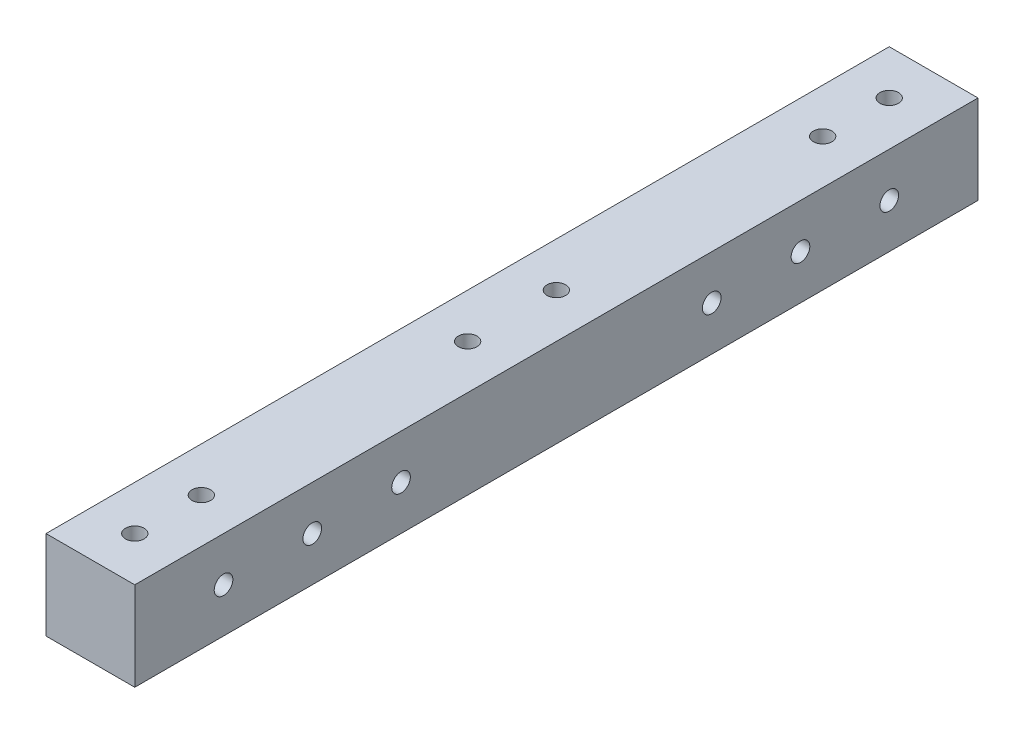
ISO-10303-21;
HEADER;
FILE_DESCRIPTION(('STEP AP214'),'2;1');
FILE_NAME('part.step','',(''),(''),'','','');
FILE_SCHEMA(('AUTOMOTIVE_DESIGN { 1 0 10303 214 1 1 1 1 }'));
ENDSEC;
DATA;
#1=APPLICATION_CONTEXT('core data for automotive mechanical design processes');
#2=APPLICATION_PROTOCOL_DEFINITION('international standard','automotive_design',2000,#1);
#3=PRODUCT_CONTEXT('',#1,'mechanical');
#4=PRODUCT('Part','Part','',(#3));
#5=PRODUCT_RELATED_PRODUCT_CATEGORY('part','',(#4));
#6=PRODUCT_DEFINITION_FORMATION('','',#4);
#7=PRODUCT_DEFINITION_CONTEXT('part definition',#1,'design');
#8=PRODUCT_DEFINITION('design','',#6,#7);
#9=PRODUCT_DEFINITION_SHAPE('','',#8);
#10=(LENGTH_UNIT() NAMED_UNIT(*) SI_UNIT(.MILLI.,.METRE.));
#11=(NAMED_UNIT(*) PLANE_ANGLE_UNIT() SI_UNIT($,.RADIAN.));
#12=(NAMED_UNIT(*) SI_UNIT($,.STERADIAN.) SOLID_ANGLE_UNIT());
#13=UNCERTAINTY_MEASURE_WITH_UNIT(LENGTH_MEASURE(1.E-05),#10,'distance_accuracy_value','');
#14=(GEOMETRIC_REPRESENTATION_CONTEXT(3) GLOBAL_UNCERTAINTY_ASSIGNED_CONTEXT((#13)) GLOBAL_UNIT_ASSIGNED_CONTEXT((#10,
#11,#12)) REPRESENTATION_CONTEXT('',''));
#15=CARTESIAN_POINT('',(0.,0.,0.));
#16=DIRECTION('',(0.,0.,1.));
#17=DIRECTION('',(1.,0.,0.));
#18=AXIS2_PLACEMENT_3D('',#15,#16,#17);
#19=CARTESIAN_POINT('',(10.,10.,190.));
#20=DIRECTION('',(-1.,0.,0.));
#21=DIRECTION('',(0.,-1.,0.));
#22=AXIS2_PLACEMENT_3D('',#19,#20,#21);
#23=PLANE('',#22);
#24=CARTESIAN_POINT('',(10.,0.,20.));
#25=DIRECTION('',(-1.,0.,0.));
#26=DIRECTION('',(0.,-1.,0.));
#27=AXIS2_PLACEMENT_3D('',#24,#25,#26);
#28=CIRCLE('',#27,2.1);
#29=CARTESIAN_POINT('',(10.,-2.1,20.));
#30=VERTEX_POINT('',#29);
#31=EDGE_CURVE('E102',#30,#30,#28,.T.);
#32=ORIENTED_EDGE('',*,*,#31,.T.);
#33=EDGE_LOOP('',(#32));
#34=FACE_BOUND('',#33,.T.);
#35=CARTESIAN_POINT('',(10.,0.,60.));
#36=DIRECTION('',(-1.,0.,0.));
#37=DIRECTION('',(0.,-1.,0.));
#38=AXIS2_PLACEMENT_3D('',#35,#36,#37);
#39=CIRCLE('',#38,2.1);
#40=CARTESIAN_POINT('',(10.,-2.1,60.));
#41=VERTEX_POINT('',#40);
#42=EDGE_CURVE('E157',#41,#41,#39,.T.);
#43=ORIENTED_EDGE('',*,*,#42,.T.);
#44=EDGE_LOOP('',(#43));
#45=FACE_BOUND('',#44,.T.);
#46=CARTESIAN_POINT('',(10.,0.,130.));
#47=DIRECTION('',(-1.,0.,0.));
#48=DIRECTION('',(0.,-1.,0.));
#49=AXIS2_PLACEMENT_3D('',#46,#47,#48);
#50=CIRCLE('',#49,2.09999999999999);
#51=CARTESIAN_POINT('',(10.,-2.09999999999999,130.));
#52=VERTEX_POINT('',#51);
#53=EDGE_CURVE('E154',#52,#52,#50,.T.);
#54=ORIENTED_EDGE('',*,*,#53,.T.);
#55=EDGE_LOOP('',(#54));
#56=FACE_BOUND('',#55,.T.);
#57=CARTESIAN_POINT('',(10.,0.,170.));
#58=DIRECTION('',(-1.,0.,0.));
#59=DIRECTION('',(0.,-1.,0.));
#60=AXIS2_PLACEMENT_3D('',#57,#58,#59);
#61=CIRCLE('',#60,2.09999999999999);
#62=CARTESIAN_POINT('',(10.,-2.09999999999999,170.));
#63=VERTEX_POINT('',#62);
#64=EDGE_CURVE('E151',#63,#63,#61,.T.);
#65=ORIENTED_EDGE('',*,*,#64,.T.);
#66=EDGE_LOOP('',(#65));
#67=FACE_BOUND('',#66,.T.);
#68=CARTESIAN_POINT('',(10.,0.,150.));
#69=DIRECTION('',(-1.,0.,0.));
#70=DIRECTION('',(0.,-1.,0.));
#71=AXIS2_PLACEMENT_3D('',#68,#69,#70);
#72=CIRCLE('',#71,2.09999999999999);
#73=CARTESIAN_POINT('',(10.,-2.09999999999999,150.));
#74=VERTEX_POINT('',#73);
#75=EDGE_CURVE('E148',#74,#74,#72,.T.);
#76=ORIENTED_EDGE('',*,*,#75,.T.);
#77=EDGE_LOOP('',(#76));
#78=FACE_BOUND('',#77,.T.);
#79=CARTESIAN_POINT('',(10.,0.,40.));
#80=DIRECTION('',(-1.,0.,0.));
#81=DIRECTION('',(0.,-1.,0.));
#82=AXIS2_PLACEMENT_3D('',#79,#80,#81);
#83=CIRCLE('',#82,2.1);
#84=CARTESIAN_POINT('',(10.,-2.1,40.));
#85=VERTEX_POINT('',#84);
#86=EDGE_CURVE('E145',#85,#85,#83,.T.);
#87=ORIENTED_EDGE('',*,*,#86,.T.);
#88=EDGE_LOOP('',(#87));
#89=FACE_BOUND('',#88,.T.);
#90=DIRECTION('',(0.,1.,0.));
#91=VECTOR('',#90,1.);
#92=CARTESIAN_POINT('',(10.,10.,0.));
#93=LINE('',#92,#91);
#94=CARTESIAN_POINT('',(10.,-10.,0.));
#95=VERTEX_POINT('',#94);
#96=CARTESIAN_POINT('',(10.,10.,0.));
#97=VERTEX_POINT('',#96);
#98=EDGE_CURVE('E99',#95,#97,#93,.T.);
#99=ORIENTED_EDGE('',*,*,#98,.T.);
#100=DIRECTION('',(0.,0.,-1.));
#101=VECTOR('',#100,1.);
#102=CARTESIAN_POINT('',(10.,10.,190.));
#103=LINE('',#102,#101);
#104=CARTESIAN_POINT('',(10.,10.,190.));
#105=VERTEX_POINT('',#104);
#106=EDGE_CURVE('E11',#105,#97,#103,.T.);
#107=ORIENTED_EDGE('',*,*,#106,.F.);
#108=DIRECTION('',(0.,1.,0.));
#109=VECTOR('',#108,1.);
#110=CARTESIAN_POINT('',(10.,10.,190.));
#111=LINE('',#110,#109);
#112=CARTESIAN_POINT('',(10.,-10.,190.));
#113=VERTEX_POINT('',#112);
#114=EDGE_CURVE('E86',#113,#105,#111,.T.);
#115=ORIENTED_EDGE('',*,*,#114,.F.);
#116=DIRECTION('',(0.,0.,-1.));
#117=VECTOR('',#116,1.);
#118=CARTESIAN_POINT('',(10.,-10.,190.));
#119=LINE('',#118,#117);
#120=EDGE_CURVE('E95',#113,#95,#119,.T.);
#121=ORIENTED_EDGE('',*,*,#120,.T.);
#122=EDGE_LOOP('',(#99,#107,#115,#121));
#123=FACE_BOUND('',#122,.T.);
#124=ADVANCED_FACE('F33',(#34,#45,#56,#67,#78,#89,#123),#23,.F.);
#125=CARTESIAN_POINT('',(-10.,10.,190.));
#126=DIRECTION('',(0.,-1.,0.));
#127=DIRECTION('',(0.,0.,-1.));
#128=AXIS2_PLACEMENT_3D('',#125,#126,#127);
#129=PLANE('',#128);
#130=CARTESIAN_POINT('',(0.,10.,85.));
#131=DIRECTION('',(0.,1.,0.));
#132=DIRECTION('',(0.,0.,1.));
#133=AXIS2_PLACEMENT_3D('',#130,#131,#132);
#134=CIRCLE('',#133,2.1);
#135=CARTESIAN_POINT('',(0.,10.,87.1));
#136=VERTEX_POINT('',#135);
#137=EDGE_CURVE('E261',#136,#136,#134,.T.);
#138=ORIENTED_EDGE('',*,*,#137,.F.);
#139=EDGE_LOOP('',(#138));
#140=FACE_BOUND('',#139,.T.);
#141=CARTESIAN_POINT('',(0.,10.,105.));
#142=DIRECTION('',(0.,1.,0.));
#143=DIRECTION('',(0.,0.,-1.));
#144=AXIS2_PLACEMENT_3D('',#141,#142,#143);
#145=CIRCLE('',#144,2.1);
#146=CARTESIAN_POINT('',(0.,10.,102.9));
#147=VERTEX_POINT('',#146);
#148=EDGE_CURVE('E266',#147,#147,#145,.T.);
#149=ORIENTED_EDGE('',*,*,#148,.F.);
#150=EDGE_LOOP('',(#149));
#151=FACE_BOUND('',#150,.T.);
#152=CARTESIAN_POINT('',(0.,10.,180.));
#153=DIRECTION('',(0.,1.,0.));
#154=DIRECTION('',(0.,0.,1.));
#155=AXIS2_PLACEMENT_3D('',#152,#153,#154);
#156=CIRCLE('',#155,2.1);
#157=CARTESIAN_POINT('',(0.,10.,182.1));
#158=VERTEX_POINT('',#157);
#159=EDGE_CURVE('E112',#158,#158,#156,.T.);
#160=ORIENTED_EDGE('',*,*,#159,.F.);
#161=EDGE_LOOP('',(#160));
#162=FACE_BOUND('',#161,.T.);
#163=CARTESIAN_POINT('',(0.,10.,165.));
#164=DIRECTION('',(0.,1.,0.));
#165=DIRECTION('',(0.,0.,1.));
#166=AXIS2_PLACEMENT_3D('',#163,#164,#165);
#167=CIRCLE('',#166,2.1);
#168=CARTESIAN_POINT('',(0.,10.,167.1));
#169=VERTEX_POINT('',#168);
#170=EDGE_CURVE('E273',#169,#169,#167,.T.);
#171=ORIENTED_EDGE('',*,*,#170,.F.);
#172=EDGE_LOOP('',(#171));
#173=FACE_BOUND('',#172,.T.);
#174=CARTESIAN_POINT('',(0.,10.,25.));
#175=DIRECTION('',(0.,1.,0.));
#176=DIRECTION('',(0.,0.,-1.));
#177=AXIS2_PLACEMENT_3D('',#174,#175,#176);
#178=CIRCLE('',#177,2.1);
#179=CARTESIAN_POINT('',(0.,10.,22.9));
#180=VERTEX_POINT('',#179);
#181=EDGE_CURVE('E275',#180,#180,#178,.T.);
#182=ORIENTED_EDGE('',*,*,#181,.F.);
#183=EDGE_LOOP('',(#182));
#184=FACE_BOUND('',#183,.T.);
#185=CARTESIAN_POINT('',(0.,10.,10.));
#186=DIRECTION('',(0.,1.,0.));
#187=DIRECTION('',(0.,0.,-1.));
#188=AXIS2_PLACEMENT_3D('',#185,#186,#187);
#189=CIRCLE('',#188,2.1);
#190=CARTESIAN_POINT('',(0.,10.,7.90000000000001));
#191=VERTEX_POINT('',#190);
#192=EDGE_CURVE('E132',#191,#191,#189,.T.);
#193=ORIENTED_EDGE('',*,*,#192,.F.);
#194=EDGE_LOOP('',(#193));
#195=FACE_BOUND('',#194,.T.);
#196=DIRECTION('',(-1.,0.,0.));
#197=VECTOR('',#196,1.);
#198=CARTESIAN_POINT('',(-10.,10.,0.));
#199=LINE('',#198,#197);
#200=CARTESIAN_POINT('',(-10.,10.,0.));
#201=VERTEX_POINT('',#200);
#202=EDGE_CURVE('E90',#97,#201,#199,.T.);
#203=ORIENTED_EDGE('',*,*,#202,.T.);
#204=DIRECTION('',(0.,0.,-1.));
#205=VECTOR('',#204,1.);
#206=CARTESIAN_POINT('',(-10.,10.,190.));
#207=LINE('',#206,#205);
#208=CARTESIAN_POINT('',(-10.,10.,190.));
#209=VERTEX_POINT('',#208);
#210=EDGE_CURVE('E42',#209,#201,#207,.T.);
#211=ORIENTED_EDGE('',*,*,#210,.F.);
#212=DIRECTION('',(-1.,0.,0.));
#213=VECTOR('',#212,1.);
#214=CARTESIAN_POINT('',(-10.,10.,190.));
#215=LINE('',#214,#213);
#216=EDGE_CURVE('E81',#105,#209,#215,.T.);
#217=ORIENTED_EDGE('',*,*,#216,.F.);
#218=ORIENTED_EDGE('',*,*,#106,.T.);
#219=EDGE_LOOP('',(#203,#211,#217,#218));
#220=FACE_BOUND('',#219,.T.);
#221=ADVANCED_FACE('F89',(#140,#151,#162,#173,#184,#195,#220),#129,.F.);
#222=CARTESIAN_POINT('',(-10.,10.,190.));
#223=DIRECTION('',(1.,0.,0.));
#224=DIRECTION('',(0.,1.,0.));
#225=AXIS2_PLACEMENT_3D('',#222,#223,#224);
#226=PLANE('',#225);
#227=CARTESIAN_POINT('',(-9.99999999999999,0.,20.));
#228=DIRECTION('',(-1.,0.,0.));
#229=DIRECTION('',(0.,-1.,0.));
#230=AXIS2_PLACEMENT_3D('',#227,#228,#229);
#231=CIRCLE('',#230,2.1);
#232=CARTESIAN_POINT('',(-9.99999999999999,-2.1,20.));
#233=VERTEX_POINT('',#232);
#234=EDGE_CURVE('E134',#233,#233,#231,.T.);
#235=ORIENTED_EDGE('',*,*,#234,.F.);
#236=EDGE_LOOP('',(#235));
#237=FACE_BOUND('',#236,.T.);
#238=CARTESIAN_POINT('',(-9.99999999999999,0.,60.));
#239=DIRECTION('',(-1.,0.,0.));
#240=DIRECTION('',(0.,-1.,0.));
#241=AXIS2_PLACEMENT_3D('',#238,#239,#240);
#242=CIRCLE('',#241,2.1);
#243=CARTESIAN_POINT('',(-9.99999999999999,-2.1,60.));
#244=VERTEX_POINT('',#243);
#245=EDGE_CURVE('E138',#244,#244,#242,.T.);
#246=ORIENTED_EDGE('',*,*,#245,.F.);
#247=EDGE_LOOP('',(#246));
#248=FACE_BOUND('',#247,.T.);
#249=CARTESIAN_POINT('',(-9.99999999999999,0.,130.));
#250=DIRECTION('',(-1.,0.,0.));
#251=DIRECTION('',(0.,1.,0.));
#252=AXIS2_PLACEMENT_3D('',#249,#250,#251);
#253=CIRCLE('',#252,2.09999999999999);
#254=CARTESIAN_POINT('',(-9.99999999999999,2.09999999999999,130.));
#255=VERTEX_POINT('',#254);
#256=EDGE_CURVE('E128',#255,#255,#253,.T.);
#257=ORIENTED_EDGE('',*,*,#256,.F.);
#258=EDGE_LOOP('',(#257));
#259=FACE_BOUND('',#258,.T.);
#260=CARTESIAN_POINT('',(-9.99999999999999,0.,170.));
#261=DIRECTION('',(-1.,0.,0.));
#262=DIRECTION('',(0.,1.,0.));
#263=AXIS2_PLACEMENT_3D('',#260,#261,#262);
#264=CIRCLE('',#263,2.09999999999999);
#265=CARTESIAN_POINT('',(-9.99999999999999,2.09999999999999,170.));
#266=VERTEX_POINT('',#265);
#267=EDGE_CURVE('E123',#266,#266,#264,.T.);
#268=ORIENTED_EDGE('',*,*,#267,.F.);
#269=EDGE_LOOP('',(#268));
#270=FACE_BOUND('',#269,.T.);
#271=CARTESIAN_POINT('',(-9.99999999999999,0.,150.));
#272=DIRECTION('',(-1.,0.,0.));
#273=DIRECTION('',(0.,1.,0.));
#274=AXIS2_PLACEMENT_3D('',#271,#272,#273);
#275=CIRCLE('',#274,2.09999999999999);
#276=CARTESIAN_POINT('',(-9.99999999999999,2.09999999999999,150.));
#277=VERTEX_POINT('',#276);
#278=EDGE_CURVE('E119',#277,#277,#275,.T.);
#279=ORIENTED_EDGE('',*,*,#278,.F.);
#280=EDGE_LOOP('',(#279));
#281=FACE_BOUND('',#280,.T.);
#282=CARTESIAN_POINT('',(-9.99999999999999,0.,40.));
#283=DIRECTION('',(-1.,0.,0.));
#284=DIRECTION('',(0.,-1.,0.));
#285=AXIS2_PLACEMENT_3D('',#282,#283,#284);
#286=CIRCLE('',#285,2.1);
#287=CARTESIAN_POINT('',(-9.99999999999999,-2.1,40.));
#288=VERTEX_POINT('',#287);
#289=EDGE_CURVE('E137',#288,#288,#286,.T.);
#290=ORIENTED_EDGE('',*,*,#289,.F.);
#291=EDGE_LOOP('',(#290));
#292=FACE_BOUND('',#291,.T.);
#293=DIRECTION('',(0.,-1.,0.));
#294=VECTOR('',#293,1.);
#295=CARTESIAN_POINT('',(-10.,10.,0.));
#296=LINE('',#295,#294);
#297=CARTESIAN_POINT('',(-9.99999999999999,-10.,0.));
#298=VERTEX_POINT('',#297);
#299=EDGE_CURVE('E68',#201,#298,#296,.T.);
#300=ORIENTED_EDGE('',*,*,#299,.T.);
#301=DIRECTION('',(0.,0.,-1.));
#302=VECTOR('',#301,1.);
#303=CARTESIAN_POINT('',(-9.99999999999999,-10.,190.));
#304=LINE('',#303,#302);
#305=CARTESIAN_POINT('',(-9.99999999999999,-10.,190.));
#306=VERTEX_POINT('',#305);
#307=EDGE_CURVE('E91',#306,#298,#304,.T.);
#308=ORIENTED_EDGE('',*,*,#307,.F.);
#309=DIRECTION('',(0.,-1.,0.));
#310=VECTOR('',#309,1.);
#311=CARTESIAN_POINT('',(-10.,10.,190.));
#312=LINE('',#311,#310);
#313=EDGE_CURVE('E84',#209,#306,#312,.T.);
#314=ORIENTED_EDGE('',*,*,#313,.F.);
#315=ORIENTED_EDGE('',*,*,#210,.T.);
#316=EDGE_LOOP('',(#300,#308,#314,#315));
#317=FACE_BOUND('',#316,.T.);
#318=ADVANCED_FACE('F93',(#237,#248,#259,#270,#281,#292,#317),#226,.F.);
#319=CARTESIAN_POINT('',(-9.99999999999999,-10.,190.));
#320=DIRECTION('',(0.,1.,0.));
#321=DIRECTION('',(0.,0.,1.));
#322=AXIS2_PLACEMENT_3D('',#319,#320,#321);
#323=PLANE('',#322);
#324=CARTESIAN_POINT('',(0.,-10.,85.));
#325=DIRECTION('',(0.,1.,0.));
#326=DIRECTION('',(0.,0.,1.));
#327=AXIS2_PLACEMENT_3D('',#324,#325,#326);
#328=CIRCLE('',#327,2.1);
#329=CARTESIAN_POINT('',(0.,-10.,87.1));
#330=VERTEX_POINT('',#329);
#331=EDGE_CURVE('E259',#330,#330,#328,.T.);
#332=ORIENTED_EDGE('',*,*,#331,.T.);
#333=EDGE_LOOP('',(#332));
#334=FACE_BOUND('',#333,.T.);
#335=CARTESIAN_POINT('',(0.,-10.,105.));
#336=DIRECTION('',(0.,1.,0.));
#337=DIRECTION('',(0.,0.,-1.));
#338=AXIS2_PLACEMENT_3D('',#335,#336,#337);
#339=CIRCLE('',#338,2.1);
#340=CARTESIAN_POINT('',(0.,-10.,102.9));
#341=VERTEX_POINT('',#340);
#342=EDGE_CURVE('E262',#341,#341,#339,.T.);
#343=ORIENTED_EDGE('',*,*,#342,.T.);
#344=EDGE_LOOP('',(#343));
#345=FACE_BOUND('',#344,.T.);
#346=CARTESIAN_POINT('',(0.,-10.,180.));
#347=DIRECTION('',(0.,1.,0.));
#348=DIRECTION('',(0.,0.,1.));
#349=AXIS2_PLACEMENT_3D('',#346,#347,#348);
#350=CIRCLE('',#349,2.1);
#351=CARTESIAN_POINT('',(0.,-10.,182.1));
#352=VERTEX_POINT('',#351);
#353=EDGE_CURVE('E36',#352,#352,#350,.T.);
#354=ORIENTED_EDGE('',*,*,#353,.T.);
#355=EDGE_LOOP('',(#354));
#356=FACE_BOUND('',#355,.T.);
#357=CARTESIAN_POINT('',(0.,-10.,165.));
#358=DIRECTION('',(0.,1.,0.));
#359=DIRECTION('',(0.,0.,1.));
#360=AXIS2_PLACEMENT_3D('',#357,#358,#359);
#361=CIRCLE('',#360,2.1);
#362=CARTESIAN_POINT('',(0.,-10.,167.1));
#363=VERTEX_POINT('',#362);
#364=EDGE_CURVE('E114',#363,#363,#361,.T.);
#365=ORIENTED_EDGE('',*,*,#364,.T.);
#366=EDGE_LOOP('',(#365));
#367=FACE_BOUND('',#366,.T.);
#368=CARTESIAN_POINT('',(0.,-10.,25.));
#369=DIRECTION('',(0.,1.,0.));
#370=DIRECTION('',(0.,0.,1.));
#371=AXIS2_PLACEMENT_3D('',#368,#369,#370);
#372=CIRCLE('',#371,2.1);
#373=CARTESIAN_POINT('',(0.,-10.,27.1));
#374=VERTEX_POINT('',#373);
#375=EDGE_CURVE('E111',#374,#374,#372,.T.);
#376=ORIENTED_EDGE('',*,*,#375,.T.);
#377=EDGE_LOOP('',(#376));
#378=FACE_BOUND('',#377,.T.);
#379=CARTESIAN_POINT('',(0.,-10.,10.));
#380=DIRECTION('',(0.,1.,0.));
#381=DIRECTION('',(0.,0.,1.));
#382=AXIS2_PLACEMENT_3D('',#379,#380,#381);
#383=CIRCLE('',#382,2.1);
#384=CARTESIAN_POINT('',(0.,-10.,12.1));
#385=VERTEX_POINT('',#384);
#386=EDGE_CURVE('E108',#385,#385,#383,.T.);
#387=ORIENTED_EDGE('',*,*,#386,.T.);
#388=EDGE_LOOP('',(#387));
#389=FACE_BOUND('',#388,.T.);
#390=DIRECTION('',(1.,0.,0.));
#391=VECTOR('',#390,1.);
#392=CARTESIAN_POINT('',(-9.99999999999999,-10.,0.));
#393=LINE('',#392,#391);
#394=EDGE_CURVE('E74',#298,#95,#393,.T.);
#395=ORIENTED_EDGE('',*,*,#394,.T.);
#396=ORIENTED_EDGE('',*,*,#120,.F.);
#397=DIRECTION('',(1.,0.,0.));
#398=VECTOR('',#397,1.);
#399=CARTESIAN_POINT('',(-9.99999999999999,-10.,190.));
#400=LINE('',#399,#398);
#401=EDGE_CURVE('E51',#306,#113,#400,.T.);
#402=ORIENTED_EDGE('',*,*,#401,.F.);
#403=ORIENTED_EDGE('',*,*,#307,.T.);
#404=EDGE_LOOP('',(#395,#396,#402,#403));
#405=FACE_BOUND('',#404,.T.);
#406=ADVANCED_FACE('F190',(#334,#345,#356,#367,#378,#389,#405),#323,.F.);
#407=CARTESIAN_POINT('',(0.,0.,190.));
#408=DIRECTION('',(0.,0.,1.));
#409=DIRECTION('',(1.,0.,0.));
#410=AXIS2_PLACEMENT_3D('',#407,#408,#409);
#411=PLANE('',#410);
#412=ORIENTED_EDGE('',*,*,#114,.T.);
#413=ORIENTED_EDGE('',*,*,#216,.T.);
#414=ORIENTED_EDGE('',*,*,#313,.T.);
#415=ORIENTED_EDGE('',*,*,#401,.T.);
#416=EDGE_LOOP('',(#412,#413,#414,#415));
#417=FACE_BOUND('',#416,.T.);
#418=ADVANCED_FACE('F82',(#417),#411,.T.);
#419=CARTESIAN_POINT('',(0.,0.,0.));
#420=DIRECTION('',(0.,0.,1.));
#421=DIRECTION('',(1.,0.,0.));
#422=AXIS2_PLACEMENT_3D('',#419,#420,#421);
#423=PLANE('',#422);
#424=ORIENTED_EDGE('',*,*,#98,.F.);
#425=ORIENTED_EDGE('',*,*,#394,.F.);
#426=ORIENTED_EDGE('',*,*,#299,.F.);
#427=ORIENTED_EDGE('',*,*,#202,.F.);
#428=EDGE_LOOP('',(#424,#425,#426,#427));
#429=FACE_BOUND('',#428,.T.);
#430=ADVANCED_FACE('F199',(#429),#423,.F.);
#431=CARTESIAN_POINT('',(57.,0.,40.));
#432=DIRECTION('',(-1.,0.,0.));
#433=DIRECTION('',(0.,-1.,0.));
#434=AXIS2_PLACEMENT_3D('',#431,#432,#433);
#435=CYLINDRICAL_SURFACE('',#434,2.1);
#436=ORIENTED_EDGE('',*,*,#289,.T.);
#437=EDGE_LOOP('',(#436));
#438=FACE_BOUND('',#437,.T.);
#439=ORIENTED_EDGE('',*,*,#86,.F.);
#440=EDGE_LOOP('',(#439));
#441=FACE_BOUND('',#440,.T.);
#442=ADVANCED_FACE('F202',(#438,#441),#435,.F.);
#443=CARTESIAN_POINT('',(57.,0.,150.));
#444=DIRECTION('',(-1.,0.,0.));
#445=DIRECTION('',(0.,-1.,0.));
#446=AXIS2_PLACEMENT_3D('',#443,#444,#445);
#447=CYLINDRICAL_SURFACE('',#446,2.09999999999999);
#448=ORIENTED_EDGE('',*,*,#278,.T.);
#449=EDGE_LOOP('',(#448));
#450=FACE_BOUND('',#449,.T.);
#451=ORIENTED_EDGE('',*,*,#75,.F.);
#452=EDGE_LOOP('',(#451));
#453=FACE_BOUND('',#452,.T.);
#454=ADVANCED_FACE('F208',(#450,#453),#447,.F.);
#455=CARTESIAN_POINT('',(57.,0.,170.));
#456=DIRECTION('',(-1.,0.,0.));
#457=DIRECTION('',(0.,-1.,0.));
#458=AXIS2_PLACEMENT_3D('',#455,#456,#457);
#459=CYLINDRICAL_SURFACE('',#458,2.09999999999999);
#460=ORIENTED_EDGE('',*,*,#267,.T.);
#461=EDGE_LOOP('',(#460));
#462=FACE_BOUND('',#461,.T.);
#463=ORIENTED_EDGE('',*,*,#64,.F.);
#464=EDGE_LOOP('',(#463));
#465=FACE_BOUND('',#464,.T.);
#466=ADVANCED_FACE('F210',(#462,#465),#459,.F.);
#467=CARTESIAN_POINT('',(57.,0.,130.));
#468=DIRECTION('',(-1.,0.,0.));
#469=DIRECTION('',(0.,-1.,0.));
#470=AXIS2_PLACEMENT_3D('',#467,#468,#469);
#471=CYLINDRICAL_SURFACE('',#470,2.09999999999999);
#472=ORIENTED_EDGE('',*,*,#256,.T.);
#473=EDGE_LOOP('',(#472));
#474=FACE_BOUND('',#473,.T.);
#475=ORIENTED_EDGE('',*,*,#53,.F.);
#476=EDGE_LOOP('',(#475));
#477=FACE_BOUND('',#476,.T.);
#478=ADVANCED_FACE('F178',(#474,#477),#471,.F.);
#479=CARTESIAN_POINT('',(57.,0.,60.));
#480=DIRECTION('',(-1.,0.,0.));
#481=DIRECTION('',(0.,-1.,0.));
#482=AXIS2_PLACEMENT_3D('',#479,#480,#481);
#483=CYLINDRICAL_SURFACE('',#482,2.1);
#484=ORIENTED_EDGE('',*,*,#245,.T.);
#485=EDGE_LOOP('',(#484));
#486=FACE_BOUND('',#485,.T.);
#487=ORIENTED_EDGE('',*,*,#42,.F.);
#488=EDGE_LOOP('',(#487));
#489=FACE_BOUND('',#488,.T.);
#490=ADVANCED_FACE('F168',(#486,#489),#483,.F.);
#491=CARTESIAN_POINT('',(57.,0.,20.));
#492=DIRECTION('',(-1.,0.,0.));
#493=DIRECTION('',(0.,-1.,0.));
#494=AXIS2_PLACEMENT_3D('',#491,#492,#493);
#495=CYLINDRICAL_SURFACE('',#494,2.1);
#496=ORIENTED_EDGE('',*,*,#234,.T.);
#497=EDGE_LOOP('',(#496));
#498=FACE_BOUND('',#497,.T.);
#499=ORIENTED_EDGE('',*,*,#31,.F.);
#500=EDGE_LOOP('',(#499));
#501=FACE_BOUND('',#500,.T.);
#502=ADVANCED_FACE('F165',(#498,#501),#495,.F.);
#503=CARTESIAN_POINT('',(0.,-22.,10.));
#504=DIRECTION('',(0.,1.,0.));
#505=DIRECTION('',(0.,0.,1.));
#506=AXIS2_PLACEMENT_3D('',#503,#504,#505);
#507=CYLINDRICAL_SURFACE('',#506,2.1);
#508=ORIENTED_EDGE('',*,*,#192,.T.);
#509=EDGE_LOOP('',(#508));
#510=FACE_BOUND('',#509,.T.);
#511=ORIENTED_EDGE('',*,*,#386,.F.);
#512=EDGE_LOOP('',(#511));
#513=FACE_BOUND('',#512,.T.);
#514=ADVANCED_FACE('F167',(#510,#513),#507,.F.);
#515=CARTESIAN_POINT('',(0.,-22.,25.));
#516=DIRECTION('',(0.,1.,0.));
#517=DIRECTION('',(0.,0.,1.));
#518=AXIS2_PLACEMENT_3D('',#515,#516,#517);
#519=CYLINDRICAL_SURFACE('',#518,2.1);
#520=ORIENTED_EDGE('',*,*,#181,.T.);
#521=EDGE_LOOP('',(#520));
#522=FACE_BOUND('',#521,.T.);
#523=ORIENTED_EDGE('',*,*,#375,.F.);
#524=EDGE_LOOP('',(#523));
#525=FACE_BOUND('',#524,.T.);
#526=ADVANCED_FACE('F175',(#522,#525),#519,.F.);
#527=CARTESIAN_POINT('',(0.,-22.,165.));
#528=DIRECTION('',(0.,1.,0.));
#529=DIRECTION('',(0.,0.,1.));
#530=AXIS2_PLACEMENT_3D('',#527,#528,#529);
#531=CYLINDRICAL_SURFACE('',#530,2.1);
#532=ORIENTED_EDGE('',*,*,#170,.T.);
#533=EDGE_LOOP('',(#532));
#534=FACE_BOUND('',#533,.T.);
#535=ORIENTED_EDGE('',*,*,#364,.F.);
#536=EDGE_LOOP('',(#535));
#537=FACE_BOUND('',#536,.T.);
#538=ADVANCED_FACE('F238',(#534,#537),#531,.F.);
#539=CARTESIAN_POINT('',(0.,-22.,180.));
#540=DIRECTION('',(0.,1.,0.));
#541=DIRECTION('',(0.,0.,1.));
#542=AXIS2_PLACEMENT_3D('',#539,#540,#541);
#543=CYLINDRICAL_SURFACE('',#542,2.1);
#544=ORIENTED_EDGE('',*,*,#159,.T.);
#545=EDGE_LOOP('',(#544));
#546=FACE_BOUND('',#545,.T.);
#547=ORIENTED_EDGE('',*,*,#353,.F.);
#548=EDGE_LOOP('',(#547));
#549=FACE_BOUND('',#548,.T.);
#550=ADVANCED_FACE('F242',(#546,#549),#543,.F.);
#551=CARTESIAN_POINT('',(0.,-10.,105.));
#552=DIRECTION('',(0.,1.,0.));
#553=DIRECTION('',(0.,0.,1.));
#554=AXIS2_PLACEMENT_3D('',#551,#552,#553);
#555=CYLINDRICAL_SURFACE('',#554,2.1);
#556=ORIENTED_EDGE('',*,*,#342,.F.);
#557=EDGE_LOOP('',(#556));
#558=FACE_BOUND('',#557,.T.);
#559=ORIENTED_EDGE('',*,*,#148,.T.);
#560=EDGE_LOOP('',(#559));
#561=FACE_BOUND('',#560,.T.);
#562=ADVANCED_FACE('F246',(#558,#561),#555,.F.);
#563=CARTESIAN_POINT('',(0.,-10.,85.));
#564=DIRECTION('',(0.,1.,0.));
#565=DIRECTION('',(0.,0.,1.));
#566=AXIS2_PLACEMENT_3D('',#563,#564,#565);
#567=CYLINDRICAL_SURFACE('',#566,2.1);
#568=ORIENTED_EDGE('',*,*,#331,.F.);
#569=EDGE_LOOP('',(#568));
#570=FACE_BOUND('',#569,.T.);
#571=ORIENTED_EDGE('',*,*,#137,.T.);
#572=EDGE_LOOP('',(#571));
#573=FACE_BOUND('',#572,.T.);
#574=ADVANCED_FACE('F250',(#570,#573),#567,.F.);
#575=CLOSED_SHELL('',(#124,#221,#318,#406,#418,#430,#442,#454,#466,#478,#490,#502,#514,#526,
#538,#550,#562,#574));
#576=MANIFOLD_SOLID_BREP('B2',#575);
#577=ADVANCED_BREP_SHAPE_REPRESENTATION('',(#18,#576),#14);
#578=SHAPE_DEFINITION_REPRESENTATION(#9,#577);
ENDSEC;
END-ISO-10303-21;
